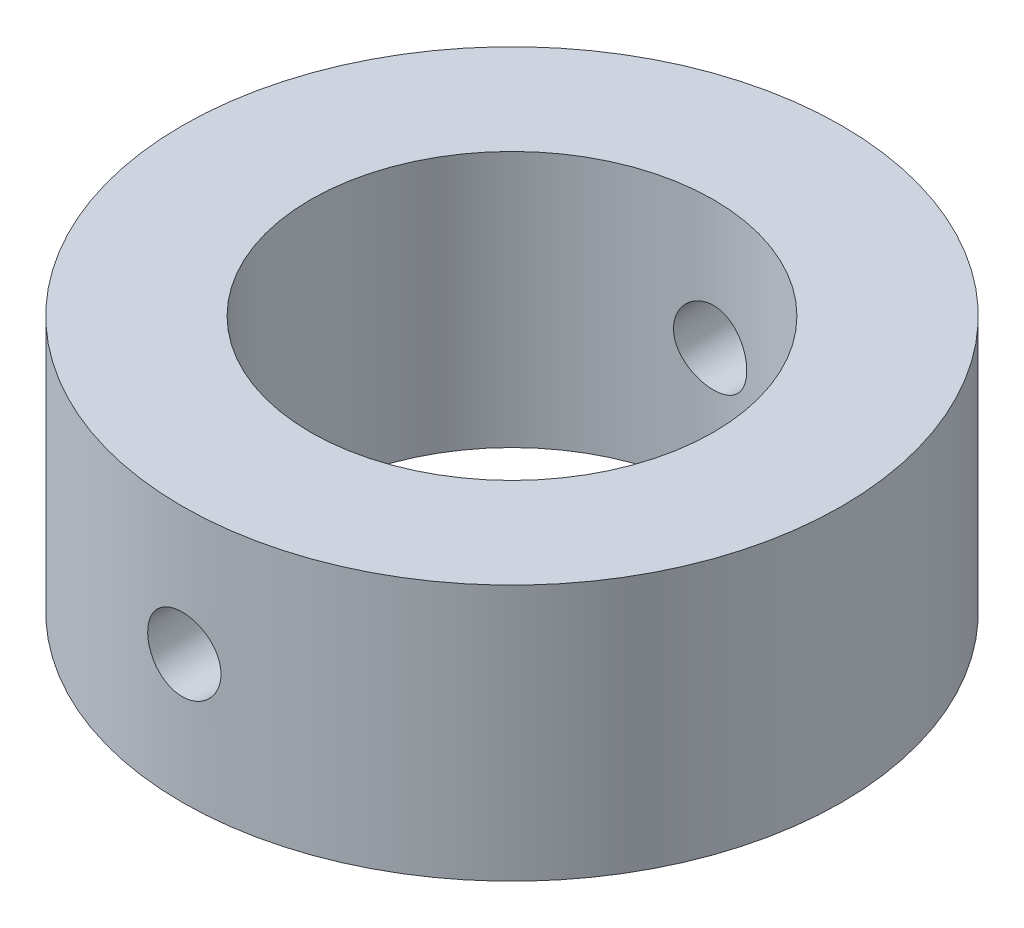
ISO-10303-21;
HEADER;
FILE_DESCRIPTION(('STEP AP214'),'2;1');
FILE_NAME('part.step','',(''),(''),'','','');
FILE_SCHEMA(('AUTOMOTIVE_DESIGN { 1 0 10303 214 1 1 1 1 }'));
ENDSEC;
DATA;
#1=APPLICATION_CONTEXT('core data for automotive mechanical design processes');
#2=APPLICATION_PROTOCOL_DEFINITION('international standard','automotive_design',2000,#1);
#3=PRODUCT_CONTEXT('',#1,'mechanical');
#4=PRODUCT('Part','Part','',(#3));
#5=PRODUCT_RELATED_PRODUCT_CATEGORY('part','',(#4));
#6=PRODUCT_DEFINITION_FORMATION('','',#4);
#7=PRODUCT_DEFINITION_CONTEXT('part definition',#1,'design');
#8=PRODUCT_DEFINITION('design','',#6,#7);
#9=PRODUCT_DEFINITION_SHAPE('','',#8);
#10=(LENGTH_UNIT() NAMED_UNIT(*) SI_UNIT(.MILLI.,.METRE.));
#11=(NAMED_UNIT(*) PLANE_ANGLE_UNIT() SI_UNIT($,.RADIAN.));
#12=(NAMED_UNIT(*) SI_UNIT($,.STERADIAN.) SOLID_ANGLE_UNIT());
#13=UNCERTAINTY_MEASURE_WITH_UNIT(LENGTH_MEASURE(1.E-05),#10,'distance_accuracy_value','');
#14=(GEOMETRIC_REPRESENTATION_CONTEXT(3) GLOBAL_UNCERTAINTY_ASSIGNED_CONTEXT((#13)) GLOBAL_UNIT_ASSIGNED_CONTEXT((#10,
#11,#12)) REPRESENTATION_CONTEXT('',''));
#15=CARTESIAN_POINT('',(0.,0.,0.));
#16=DIRECTION('',(0.,0.,1.));
#17=DIRECTION('',(1.,0.,0.));
#18=AXIS2_PLACEMENT_3D('',#15,#16,#17);
#19=CARTESIAN_POINT('',(0.,14.,0.));
#20=DIRECTION('',(0.,1.,0.));
#21=DIRECTION('',(0.,0.,1.));
#22=AXIS2_PLACEMENT_3D('',#19,#20,#21);
#23=PLANE('',#22);
#24=CARTESIAN_POINT('',(0.,14.,0.));
#25=DIRECTION('',(0.,1.,0.));
#26=DIRECTION('',(0.,0.,1.));
#27=AXIS2_PLACEMENT_3D('',#24,#25,#26);
#28=CIRCLE('',#27,18.);
#29=CARTESIAN_POINT('',(0.,14.,18.));
#30=VERTEX_POINT('',#29);
#31=EDGE_CURVE('E10',#30,#30,#28,.T.);
#32=ORIENTED_EDGE('',*,*,#31,.T.);
#33=EDGE_LOOP('',(#32));
#34=FACE_BOUND('',#33,.T.);
#35=CARTESIAN_POINT('',(0.,14.,0.));
#36=DIRECTION('',(0.,1.,0.));
#37=DIRECTION('',(0.,0.,1.));
#38=AXIS2_PLACEMENT_3D('',#35,#36,#37);
#39=CIRCLE('',#38,11.);
#40=CARTESIAN_POINT('',(0.,14.,11.));
#41=VERTEX_POINT('',#40);
#42=EDGE_CURVE('E61',#41,#41,#39,.T.);
#43=ORIENTED_EDGE('',*,*,#42,.F.);
#44=EDGE_LOOP('',(#43));
#45=FACE_BOUND('',#44,.T.);
#46=ADVANCED_FACE('F40',(#34,#45),#23,.T.);
#47=CARTESIAN_POINT('',(0.,0.,0.));
#48=DIRECTION('',(0.,1.,0.));
#49=DIRECTION('',(0.,0.,1.));
#50=AXIS2_PLACEMENT_3D('',#47,#48,#49);
#51=PLANE('',#50);
#52=CARTESIAN_POINT('',(0.,0.,0.));
#53=DIRECTION('',(0.,1.,0.));
#54=DIRECTION('',(0.,0.,1.));
#55=AXIS2_PLACEMENT_3D('',#52,#53,#54);
#56=CIRCLE('',#55,18.);
#57=CARTESIAN_POINT('',(0.,0.,18.));
#58=VERTEX_POINT('',#57);
#59=EDGE_CURVE('E55',#58,#58,#56,.T.);
#60=ORIENTED_EDGE('',*,*,#59,.F.);
#61=EDGE_LOOP('',(#60));
#62=FACE_BOUND('',#61,.T.);
#63=CARTESIAN_POINT('',(0.,0.,0.));
#64=DIRECTION('',(0.,1.,0.));
#65=DIRECTION('',(0.,0.,1.));
#66=AXIS2_PLACEMENT_3D('',#63,#64,#65);
#67=CIRCLE('',#66,11.);
#68=CARTESIAN_POINT('',(0.,0.,11.));
#69=VERTEX_POINT('',#68);
#70=EDGE_CURVE('E64',#69,#69,#67,.T.);
#71=ORIENTED_EDGE('',*,*,#70,.T.);
#72=EDGE_LOOP('',(#71));
#73=FACE_BOUND('',#72,.T.);
#74=ADVANCED_FACE('F105',(#62,#73),#51,.F.);
#75=CARTESIAN_POINT('',(0.,14.,0.));
#76=DIRECTION('',(0.,-1.,0.));
#77=DIRECTION('',(0.,0.,-1.));
#78=AXIS2_PLACEMENT_3D('',#75,#76,#77);
#79=CYLINDRICAL_SURFACE('',#78,18.);
#80=CARTESIAN_POINT('',(0.,9.,-18.));
#81=CARTESIAN_POINT('',(-0.111970632349519,8.99999518717274,-17.9999985855436));
#82=CARTESIAN_POINT('',(-0.22401360296951,8.99056525489512,-17.9989441411048));
#83=CARTESIAN_POINT('',(-0.444988473846702,8.95309247157582,-17.9948391595619));
#84=CARTESIAN_POINT('',(-0.553916889117786,8.92502956094916,-17.9917864712715));
#85=CARTESIAN_POINT('',(-0.765431079070291,8.85112204481784,-17.9840293073923));
#86=CARTESIAN_POINT('',(-0.868020820737628,8.8052886941403,-17.9793258774716));
#87=CARTESIAN_POINT('',(-1.06403053009986,8.69716438580146,-17.9687919810869));
#88=CARTESIAN_POINT('',(-1.1574522117349,8.63487651233084,-17.9629617258869));
#89=CARTESIAN_POINT('',(-1.33290575747026,8.49531794987183,-17.9507977181856));
#90=CARTESIAN_POINT('',(-1.4148915795421,8.41798953514322,-17.9444620831364));
#91=CARTESIAN_POINT('',(-1.56475003710051,8.2506685239635,-17.9320167832537));
#92=CARTESIAN_POINT('',(-1.63262199299226,8.16067531804146,-17.9259071293129));
#93=CARTESIAN_POINT('',(-1.7524930181623,7.97028607176977,-17.9145866794937));
#94=CARTESIAN_POINT('',(-1.80444975542339,7.86986322295015,-17.9093782965755));
#95=CARTESIAN_POINT('',(-1.89074517800796,7.66165053931293,-17.9004741803531));
#96=CARTESIAN_POINT('',(-1.92508439501976,7.553860926932,-17.8967784014));
#97=CARTESIAN_POINT('',(-1.97503194492644,7.3344480021357,-17.8913354423153));
#98=CARTESIAN_POINT('',(-1.99071729842217,7.22284242492906,-17.8895802517469));
#99=CARTESIAN_POINT('',(-2.00315006003506,6.99857013816991,-17.8881925066123));
#100=CARTESIAN_POINT('',(-1.99989807564483,6.88590346277222,-17.8885598839559));
#101=CARTESIAN_POINT('',(-1.97461184427901,6.66324052502841,-17.891368441014));
#102=CARTESIAN_POINT('',(-1.95266200172973,6.5532345433254,-17.8938003012309));
#103=CARTESIAN_POINT('',(-1.89073461157689,6.33847737461124,-17.9004492717341));
#104=CARTESIAN_POINT('',(-1.85075676930152,6.23372627352343,-17.904666411201));
#105=CARTESIAN_POINT('',(-1.75381606079451,6.03218757683689,-17.9144214425039));
#106=CARTESIAN_POINT('',(-1.6968160688148,5.93541798398418,-17.9199622158801));
#107=CARTESIAN_POINT('',(-1.56747570663675,5.75278634926913,-17.9317378723191));
#108=CARTESIAN_POINT('',(-1.49513478176794,5.66692470197665,-17.9379727804753));
#109=CARTESIAN_POINT('',(-1.33669614893956,5.50805601569139,-17.9504756897929));
#110=CARTESIAN_POINT('',(-1.25052560566827,5.43512159477525,-17.9567436860931));
#111=CARTESIAN_POINT('',(-1.06712581996098,5.30474161832766,-17.9685745710182));
#112=CARTESIAN_POINT('',(-0.969896560277035,5.24729608695424,-17.9741374585434));
#113=CARTESIAN_POINT('',(-0.767086635535504,5.14952623523524,-17.9839338102592));
#114=CARTESIAN_POINT('',(-0.661504004801704,5.10920595902494,-17.9881669603705));
#115=CARTESIAN_POINT('',(-0.445009755639361,5.04688622495833,-17.9948238450129));
#116=CARTESIAN_POINT('',(-0.334098334257908,5.02488609021367,-17.997247646395));
#117=CARTESIAN_POINT('',(-0.110723331894269,4.99992409828247,-18.0000041106556));
#118=CARTESIAN_POINT('',(0.00172892889089268,4.99686210620379,-18.0003477720089));
#119=CARTESIAN_POINT('',(0.225544988687161,5.00959979251307,-17.998934812043));
#120=CARTESIAN_POINT('',(0.33690880589132,5.02539915509292,-17.9971782258895));
#121=CARTESIAN_POINT('',(0.555095059423332,5.07532794045585,-17.9917690933051));
#122=CARTESIAN_POINT('',(0.661928438561837,5.10941011811748,-17.9881214344582));
#123=CARTESIAN_POINT('',(0.868362270126897,5.19488827772812,-17.9793390034164));
#124=CARTESIAN_POINT('',(0.967962524792293,5.24628473285104,-17.9742041905801));
#125=CARTESIAN_POINT('',(1.15755326511746,5.36517829107097,-17.9629935700227));
#126=CARTESIAN_POINT('',(1.24750253139102,5.43274076093982,-17.9569139780361));
#127=CARTESIAN_POINT('',(1.41481983480219,5.58195529833437,-17.9445071585437));
#128=CARTESIAN_POINT('',(1.49218748015557,5.66360780445235,-17.938179923334));
#129=CARTESIAN_POINT('',(1.63249622432816,5.83912328906606,-17.925957484036));
#130=CARTESIAN_POINT('',(1.69537132537921,5.93303919047828,-17.920064336427));
#131=CARTESIAN_POINT('',(1.80445556005008,6.13015628349244,-17.9094097287312));
#132=CARTESIAN_POINT('',(1.85066496700075,6.23335732277591,-17.9046482500845));
#133=CARTESIAN_POINT('',(1.92499712101143,6.44589445871662,-17.8968094822665));
#134=CARTESIAN_POINT('',(1.95315827481128,6.55521698574758,-17.8937286188355));
#135=CARTESIAN_POINT('',(1.99071877766797,6.77707514774163,-17.8895891957456));
#136=CARTESIAN_POINT('',(2.00011880320655,6.88961066670345,-17.8885305631698));
#137=CARTESIAN_POINT('',(1.99987957341679,7.11404415506505,-17.8885572584665));
#138=CARTESIAN_POINT('',(1.99034399043058,7.22594225068095,-17.8896309120887));
#139=CARTESIAN_POINT('',(1.9527225008048,7.4465357383256,-17.8937762295707));
#140=CARTESIAN_POINT('',(1.92463658036714,7.55523112797206,-17.8968478949167));
#141=CARTESIAN_POINT('',(1.85074191262564,7.76632751050922,-17.9046397451111));
#142=CARTESIAN_POINT('',(1.80493703938195,7.86872987363542,-17.9093595695852));
#143=CARTESIAN_POINT('',(1.69691508787252,8.0644104934481,-17.9199166120206));
#144=CARTESIAN_POINT('',(1.63469797623759,8.15768873158296,-17.9257538322538));
#145=CARTESIAN_POINT('',(1.49522995253707,8.33300424612643,-17.9379262794022));
#146=CARTESIAN_POINT('',(1.41790170900318,8.41497983547593,-17.944263963574));
#147=CARTESIAN_POINT('',(1.25056419248413,8.5648338722108,-17.9567010614173));
#148=CARTESIAN_POINT('',(1.16055190760651,8.63270896185917,-17.962800418056));
#149=CARTESIAN_POINT('',(0.970094486774867,8.75260433035013,-17.9740935209669));
#150=CARTESIAN_POINT('',(0.869618446416091,8.80457574973094,-17.9792844558708));
#151=CARTESIAN_POINT('',(0.661368495161231,8.89083749244483,-17.9881463543356));
#152=CARTESIAN_POINT('',(0.553602839944441,8.92514745073419,-17.9918190049356));
#153=CARTESIAN_POINT('',(0.371040239312598,8.96669916146577,-17.9963232552591));
#154=CARTESIAN_POINT('',(0.297404134861363,8.97916954843922,-17.9976954860037));
#155=CARTESIAN_POINT('',(0.149189389902708,8.99582154886399,-17.9995343271896));
#156=CARTESIAN_POINT('',(0.074610754477507,9.00000320698978,-18.000000942512));
#157=CARTESIAN_POINT('',(0.,9.,-18.));
#158=B_SPLINE_CURVE_WITH_KNOTS('',3,(#80,#81,#82,#83,#84,#85,#86,#87,#88,#89,#90,#91,#92,#93,
#94,#95,#96,#97,#98,#99,#100,#101,#102,#103,#104,#105,#106,#107,#108,#109,#110,#111,#112,#113,
#114,#115,#116,#117,#118,#119,#120,#121,#122,#123,#124,#125,#126,#127,#128,#129,#130,#131,#132,
#133,#134,#135,#136,#137,#138,#139,#140,#141,#142,#143,#144,#145,#146,#147,#148,#149,#150,#151,
#152,#153,#154,#155,#156,#157),.UNSPECIFIED.,.T.,.F.,(4,2,2,2,2,2,2,2,2,2,2,2,2,2,2,2,2,2,2,2,2,
2,2,2,2,2,2,2,2,2,2,2,2,2,2,2,2,2,4),(0.,0.335639414270807,0.671640752838988,1.00742963320074,
1.34315561881719,1.68019649784365,2.01725360192296,2.35519959306228,2.69313538455338,
3.02967096220247,3.36619574415512,3.70120941343134,4.03622855878184,4.37198379333011,
4.70775116959619,5.0453487253329,5.3829468076176,5.72062456954608,6.05828985448105,
6.39416820670407,6.73004093517319,7.06504987759406,7.40006797606269,7.73646430887643,
8.07287111486782,8.41078088557856,8.74868511404414,9.08586787252136,9.42303847276942,
9.75836815539861,10.0936980874527,10.4289547445926,10.7642120833782,11.1012322946639,
11.4383326684529,11.7764585228658,12.1142076528796,12.3378595549845,12.5615102516508),.UNSPECIFIED.);
#159=CARTESIAN_POINT('',(0.,9.,-18.));
#160=VERTEX_POINT('',#159);
#161=EDGE_CURVE('E91',#160,#160,#158,.T.);
#162=ORIENTED_EDGE('',*,*,#161,.T.);
#163=EDGE_LOOP('',(#162));
#164=FACE_BOUND('',#163,.T.);
#165=CARTESIAN_POINT('',(2.,7.,17.8885438199983));
#166=CARTESIAN_POINT('',(1.99999518503575,6.88803177304581,17.8885452673513));
#167=CARTESIAN_POINT('',(1.99056564422495,6.77599120047101,17.8896064083062));
#168=CARTESIAN_POINT('',(1.9530945571327,6.55502131188617,17.8937353069379));
#169=CARTESIAN_POINT('',(1.92503294287933,6.44609548275034,17.8968052281518));
#170=CARTESIAN_POINT('',(1.85112921882987,6.23458676194979,17.9045997629771));
#171=CARTESIAN_POINT('',(1.80529842543048,6.13199988140329,17.9093233232741));
#172=CARTESIAN_POINT('',(1.6971801398522,5.9359949687069,17.9198916263535));
#173=CARTESIAN_POINT('',(1.63489572561389,5.84257522615985,17.9257361593821));
#174=CARTESIAN_POINT('',(1.49534066211955,5.66711950181866,17.9379170304468));
#175=CARTESIAN_POINT('',(1.41801151386004,5.58513017364171,17.9442552283822));
#176=CARTESIAN_POINT('',(1.25068756201248,5.43526494609341,17.956692464558));
#177=CARTESIAN_POINT('',(1.16069215853742,5.3673897155578,17.9627914914535));
#178=CARTESIAN_POINT('',(0.970300975910866,5.24751525739638,17.9740818874251));
#179=CARTESIAN_POINT('',(0.869878766261949,5.19555776276641,17.9792708555609));
#180=CARTESIAN_POINT('',(0.661667471517998,5.10926076380114,17.9881361419533));
#181=CARTESIAN_POINT('',(0.553878605135573,5.0749207366687,17.9918125050957));
#182=CARTESIAN_POINT('',(0.334468008621896,5.02497150677824,17.9972252779851));
#183=CARTESIAN_POINT('',(0.222864029559306,5.00928520821169,17.9989696704928));
#184=CARTESIAN_POINT('',(-0.00140512478551065,4.99685000269704,18.0003491557537));
#185=CARTESIAN_POINT('',(-0.114070266492343,5.00010049858126,17.999984315021));
#186=CARTESIAN_POINT('',(-0.336739745879571,5.02538436478206,17.9971929428148));
#187=CARTESIAN_POINT('',(-0.446753627473802,5.04733482935178,17.9947755115965));
#188=CARTESIAN_POINT('',(-0.661526274498665,5.10926619852694,17.9881609397357));
#189=CARTESIAN_POINT('',(-0.766284958137244,5.14924738366635,17.983963771403));
#190=CARTESIAN_POINT('',(-0.967832879518121,5.24619503121668,17.9742457977887));
#191=CARTESIAN_POINT('',(-1.06460449111718,5.30319784231176,17.9687221649126));
#192=CARTESIAN_POINT('',(-1.2472389694308,5.43254423068682,17.9569703102514));
#193=CARTESIAN_POINT('',(-1.33310144059904,5.50488836396256,17.9507420629336));
#194=CARTESIAN_POINT('',(-1.49196653465317,5.66332928308718,17.9382394115377));
#195=CARTESIAN_POINT('',(-1.56489718633274,5.74949824654401,17.9319649398659));
#196=CARTESIAN_POINT('',(-1.69527030904771,5.93289352468536,17.9201104242365));
#197=CARTESIAN_POINT('',(-1.75271274805118,6.03011986223758,17.9145303817151));
#198=CARTESIAN_POINT('',(-1.85048037105374,6.23292897346975,17.9046962899179));
#199=CARTESIAN_POINT('',(-1.89080055980943,6.3385141751196,17.9004426276963));
#200=CARTESIAN_POINT('',(-1.95311933213687,6.55501401575792,17.8937507545429));
#201=CARTESIAN_POINT('',(-1.97511860833,6.66592845310717,17.891312474981));
#202=CARTESIAN_POINT('',(-2.00007735935568,6.88930489303505,17.8885396347188));
#203=CARTESIAN_POINT('',(-2.00313777083876,7.00175548459326,17.8881939216838));
#204=CARTESIAN_POINT('',(-1.99039751910215,7.22556782703135,17.8896159038576));
#205=CARTESIAN_POINT('',(-1.97459717180621,7.33692959611784,17.8913835636668));
#206=CARTESIAN_POINT('',(-1.92466859187558,7.55510548533968,17.8968229651343));
#207=CARTESIAN_POINT('',(-1.89058856475884,7.66193077267579,17.9004896978583));
#208=CARTESIAN_POINT('',(-1.80511741398991,7.86834937118393,17.9093100409564));
#209=CARTESIAN_POINT('',(-1.75372580444061,7.96794247926959,17.9144636930643));
#210=CARTESIAN_POINT('',(-1.63483941033055,8.15752829319359,17.9257040762847));
#211=CARTESIAN_POINT('',(-1.56727802875607,8.24747900693807,17.9317946280501));
#212=CARTESIAN_POINT('',(-1.41806481392953,8.41479973723392,17.9442102793975));
#213=CARTESIAN_POINT('',(-1.33641254922635,8.49216936842207,17.9505353861567));
#214=CARTESIAN_POINT('',(-1.1608962097233,8.63248248532022,17.9627413925405));
#215=CARTESIAN_POINT('',(-1.066979166732,8.69535992327815,17.968620179616));
#216=CARTESIAN_POINT('',(-0.86985915963698,8.80444825682681,17.9792400807963));
#217=CARTESIAN_POINT('',(-0.766656348352905,8.85065942663837,17.9839812136192));
#218=CARTESIAN_POINT('',(-0.554120264945936,8.92499272889714,17.9917821449637));
#219=CARTESIAN_POINT('',(-0.444800831566826,8.95315403200578,17.9948455821934));
#220=CARTESIAN_POINT('',(-0.22294920075792,8.99071588146752,17.9989609669259));
#221=CARTESIAN_POINT('',(-0.110417116473335,9.00011708770109,18.0000129851797));
#222=CARTESIAN_POINT('',(0.114018334496891,8.99988133626741,17.9999868395735));
#223=CARTESIAN_POINT('',(0.225921823844596,8.99034661842582,17.9989201153349));
#224=CARTESIAN_POINT('',(0.446526316926464,8.95272496321899,17.9947989686735));
#225=CARTESIAN_POINT('',(0.555227319914944,8.92463802153398,17.9917445457879));
#226=CARTESIAN_POINT('',(0.76633507661575,8.85073915596262,17.9839899544047));
#227=CARTESIAN_POINT('',(0.868743176076879,8.8049310371763,17.9792901392271));
#228=CARTESIAN_POINT('',(1.06443391664963,8.69690081603448,17.9687671981842));
#229=CARTESIAN_POINT('',(1.15771654277212,8.63467868671863,17.9629440704738));
#230=CARTESIAN_POINT('',(1.33303189850074,8.49520510358297,17.9507882968297));
#231=CARTESIAN_POINT('',(1.41500385164122,8.41787746860297,17.9444531678765));
#232=CARTESIAN_POINT('',(1.56485083590747,8.2505426709214,17.9320080016661));
#233=CARTESIAN_POINT('',(1.63272249971267,8.16053248806638,17.9258980184622));
#234=CARTESIAN_POINT('',(1.75261413385152,7.97007682032628,17.9145748576723));
#235=CARTESIAN_POINT('',(1.80458464165387,7.86960005134217,17.9093644999484));
#236=CARTESIAN_POINT('',(1.89084447897051,7.66134856315658,17.9004638112766));
#237=CARTESIAN_POINT('',(1.92515345522498,7.55358210473051,17.8967717922482));
#238=CARTESIAN_POINT('',(1.96670243154842,7.37102212505551,17.8922425310128));
#239=CARTESIAN_POINT('',(1.97917158766845,7.29738963768033,17.8908622174332));
#240=CARTESIAN_POINT('',(1.99582195322212,7.1491821369307,17.8890123822324));
#241=CARTESIAN_POINT('',(2.00000320832675,7.07460712875234,17.8885428555921));
#242=CARTESIAN_POINT('',(2.,7.,17.8885438199983));
#243=B_SPLINE_CURVE_WITH_KNOTS('',3,(#165,#166,#167,#168,#169,#170,#171,#172,#173,#174,#175,
#176,#177,#178,#179,#180,#181,#182,#183,#184,#185,#186,#187,#188,#189,#190,#191,#192,#193,#194,
#195,#196,#197,#198,#199,#200,#201,#202,#203,#204,#205,#206,#207,#208,#209,#210,#211,#212,#213,
#214,#215,#216,#217,#218,#219,#220,#221,#222,#223,#224,#225,#226,#227,#228,#229,#230,#231,#232,
#233,#234,#235,#236,#237,#238,#239,#240,#241,#242),.UNSPECIFIED.,.T.,.F.,(4,2,2,2,2,2,2,2,2,2,2,
2,2,2,2,2,2,2,2,2,2,2,2,2,2,2,2,2,2,2,2,2,2,2,2,2,2,2,4),(0.,0.335632188624974,
0.671626462934656,1.00740710805003,1.34312498388733,1.68017531935543,2.01724162325253,
2.35518422792107,2.69311680358594,3.02964779613957,3.36616817631888,3.70120432175367,
4.03624568008393,4.37200767925155,4.70778184908852,5.04536979065502,5.3829584303983,
5.7206454906652,6.0583197841067,6.39419284630556,6.73006028260191,7.06504632328859,
7.40004176706191,7.73644141772486,8.07285137049335,8.41076545330537,8.74867397594563,
9.08584668590625,9.42300753571449,9.7583529180042,10.0936983783768,10.4289718731341,
10.7642459185884,11.1012566562892,11.4383477839705,11.7764770582129,12.1142293791938,
12.3378704296957,12.5615102478061),.UNSPECIFIED.);
#244=CARTESIAN_POINT('',(2.,7.,17.8885438199983));
#245=VERTEX_POINT('',#244);
#246=EDGE_CURVE('E85',#245,#245,#243,.T.);
#247=ORIENTED_EDGE('',*,*,#246,.T.);
#248=EDGE_LOOP('',(#247));
#249=FACE_BOUND('',#248,.T.);
#250=ORIENTED_EDGE('',*,*,#31,.F.);
#251=EDGE_LOOP('',(#250));
#252=FACE_BOUND('',#251,.T.);
#253=ORIENTED_EDGE('',*,*,#59,.T.);
#254=EDGE_LOOP('',(#253));
#255=FACE_BOUND('',#254,.T.);
#256=ADVANCED_FACE('F42',(#164,#249,#252,#255),#79,.T.);
#257=CARTESIAN_POINT('',(0.,14.,0.));
#258=DIRECTION('',(0.,-1.,0.));
#259=DIRECTION('',(0.,0.,-1.));
#260=AXIS2_PLACEMENT_3D('',#257,#258,#259);
#261=CYLINDRICAL_SURFACE('',#260,11.);
#262=CARTESIAN_POINT('',(0.,9.,-11.));
#263=CARTESIAN_POINT('',(-0.111357271644373,8.99999568133932,-10.9999980072786));
#264=CARTESIAN_POINT('',(-0.222771449918202,8.99066824251735,-10.9982915273343));
#265=CARTESIAN_POINT('',(-0.442464406848309,8.95362653397508,-10.99164847502));
#266=CARTESIAN_POINT('',(-0.550740387266074,8.92589635141863,-10.9867091072254));
#267=CARTESIAN_POINT('',(-0.760947572513748,8.85292287032901,-10.9741532323507));
#268=CARTESIAN_POINT('',(-0.862884263930176,8.80769496781024,-10.9665390793192));
#269=CARTESIAN_POINT('',(-1.0577120033845,8.70105266880821,-10.949466714983));
#270=CARTESIAN_POINT('',(-1.15060386767904,8.63963973481181,-10.9400086703132));
#271=CARTESIAN_POINT('',(-1.32576444051238,8.50163409035729,-10.9201743349983));
#272=CARTESIAN_POINT('',(-1.40791622603346,8.42489415801924,-10.9097897259708));
#273=CARTESIAN_POINT('',(-1.55825357341079,8.25872964591017,-10.8893349521181));
#274=CARTESIAN_POINT('',(-1.62643816794977,8.16930418831085,-10.8792648091126));
#275=CARTESIAN_POINT('',(-1.74738695016477,7.97948727054023,-10.8604984020977));
#276=CARTESIAN_POINT('',(-1.80003313265556,7.87901946476963,-10.851812871101));
#277=CARTESIAN_POINT('',(-1.88765546949978,7.67048134967603,-10.836915832769));
#278=CARTESIAN_POINT('',(-1.92263305283275,7.56241165597496,-10.8307041253674));
#279=CARTESIAN_POINT('',(-1.97355197711315,7.3429853506434,-10.8215415351671));
#280=CARTESIAN_POINT('',(-1.98969666425445,7.23167740829037,-10.8185558462234));
#281=CARTESIAN_POINT('',(-2.00312248736688,7.00789559268543,-10.8160783143231));
#282=CARTESIAN_POINT('',(-2.00040521296643,6.89542181848397,-10.8165861769405));
#283=CARTESIAN_POINT('',(-1.97634934427,6.67396808586698,-10.8210066504918));
#284=CARTESIAN_POINT('',(-1.95524117699072,6.56496213210428,-10.8248771281426));
#285=CARTESIAN_POINT('',(-1.89536523340026,6.35206498163283,-10.8355206127391));
#286=CARTESIAN_POINT('',(-1.85659674743188,6.24817399064821,-10.8422937363232));
#287=CARTESIAN_POINT('',(-1.76227297789295,6.04777720922126,-10.8580238155272));
#288=CARTESIAN_POINT('',(-1.7066239037154,5.95131655733387,-10.8669929171435));
#289=CARTESIAN_POINT('',(-1.58018503374043,5.76901526305471,-10.8860962201172));
#290=CARTESIAN_POINT('',(-1.50939379023584,5.68317563735376,-10.8962305328347));
#291=CARTESIAN_POINT('',(-1.35343399418352,5.52322100355563,-10.9167064080854));
#292=CARTESIAN_POINT('',(-1.2680681726569,5.44929831156309,-10.9270488181647));
#293=CARTESIAN_POINT('',(-1.08604454069331,5.31679486651917,-10.9466375043709));
#294=CARTESIAN_POINT('',(-0.989386629498157,5.25821425037874,-10.9558837707156));
#295=CARTESIAN_POINT('',(-0.787327598497296,5.15803261021497,-10.9722553782534));
#296=CARTESIAN_POINT('',(-0.681916780395492,5.11645073130402,-10.9793783255922));
#297=CARTESIAN_POINT('',(-0.465448414462666,5.0516368075063,-10.9906820547088));
#298=CARTESIAN_POINT('',(-0.354391431316065,5.02840293142609,-10.994863130091));
#299=CARTESIAN_POINT('',(-0.131438649578499,5.00121023808088,-10.9997719337866));
#300=CARTESIAN_POINT('',(-0.0195760121089341,4.99698777654592,-11.0005468934114));
#301=CARTESIAN_POINT('',(0.203257238970967,5.00723179818149,-10.998686302475));
#302=CARTESIAN_POINT('',(0.314227893453082,5.02169742007174,-10.9960509090871));
#303=CARTESIAN_POINT('',(0.531297097592757,5.06868774956188,-10.9876950863245));
#304=CARTESIAN_POINT('',(0.637425297458317,5.10107986918283,-10.9819973157216));
#305=CARTESIAN_POINT('',(0.84274471375661,5.18286082852194,-10.9681529512222));
#306=CARTESIAN_POINT('',(0.941935480960949,5.2322507676977,-10.9600061989244));
#307=CARTESIAN_POINT('',(1.13169524707493,5.34721463780293,-10.9420497958484));
#308=CARTESIAN_POINT('',(1.22216445208488,5.41295068715592,-10.932223816146));
#309=CARTESIAN_POINT('',(1.39088213822347,5.5585203766711,-10.9120428807109));
#310=CARTESIAN_POINT('',(1.46912954974332,5.63835524941194,-10.901687878785));
#311=CARTESIAN_POINT('',(1.6121773788768,5.8110468814485,-10.8814603955764));
#312=CARTESIAN_POINT('',(1.67679836741418,5.90405330652586,-10.8715955212189));
#313=CARTESIAN_POINT('',(1.78949986552014,6.09975618140649,-10.8536151008102));
#314=CARTESIAN_POINT('',(1.83758096630795,6.20245228468438,-10.8454994922354));
#315=CARTESIAN_POINT('',(1.91557945241746,6.41415074969175,-10.8319954461548));
#316=CARTESIAN_POINT('',(1.9455810786184,6.52312123073805,-10.8265943801675));
#317=CARTESIAN_POINT('',(1.98683040178554,6.74466298863107,-10.8191012654539));
#318=CARTESIAN_POINT('',(1.99808007453629,6.85723388484892,-10.8170088681136));
#319=CARTESIAN_POINT('',(2.00144313663184,7.08098537546364,-10.8163869388262));
#320=CARTESIAN_POINT('',(1.99383937001232,7.19216167143854,-10.8178047454411));
#321=CARTESIAN_POINT('',(1.96032846912815,7.41162363801741,-10.8239270874703));
#322=CARTESIAN_POINT('',(1.93442142905718,7.51990932349428,-10.8286316059701));
#323=CARTESIAN_POINT('',(1.86515567158476,7.73037619739537,-10.8407757208091));
#324=CARTESIAN_POINT('',(1.82182581019232,7.83256716022343,-10.8482107929975));
#325=CARTESIAN_POINT('',(1.71897473664823,8.02827444716474,-10.8649817751485));
#326=CARTESIAN_POINT('',(1.65945247569007,8.12179020884559,-10.8743178082294));
#327=CARTESIAN_POINT('',(1.52491543662799,8.29891287459562,-10.8940032465147));
#328=CARTESIAN_POINT('',(1.44969415553099,8.38236156987076,-10.9043650783111));
#329=CARTESIAN_POINT('',(1.28632651423364,8.53554708101219,-10.9248399206865));
#330=CARTESIAN_POINT('',(1.19817718680093,8.60528074039225,-10.9349528735191));
#331=CARTESIAN_POINT('',(1.0105711896463,8.72960029712349,-10.9538897429719));
#332=CARTESIAN_POINT('',(0.911025849790496,8.78405418518013,-10.9627021317343));
#333=CARTESIAN_POINT('',(0.704073905086344,8.87537921607406,-10.9779326099335));
#334=CARTESIAN_POINT('',(0.596674925486669,8.91226715927832,-10.9843529858473));
#335=CARTESIAN_POINT('',(0.407441749458405,8.95977543030219,-10.9927407037649));
#336=CARTESIAN_POINT('',(0.32672542727649,8.97483433296035,-10.9954478027358));
#337=CARTESIAN_POINT('',(0.164016342132203,8.9949480937949,-10.9990781643304));
#338=CARTESIAN_POINT('',(0.0820236084408331,9.00000318104177,-11.0000014678));
#339=CARTESIAN_POINT('',(0.,9.,-11.));
#340=B_SPLINE_CURVE_WITH_KNOTS('',3,(#262,#263,#264,#265,#266,#267,#268,#269,#270,#271,#272,
#273,#274,#275,#276,#277,#278,#279,#280,#281,#282,#283,#284,#285,#286,#287,#288,#289,#290,#291,
#292,#293,#294,#295,#296,#297,#298,#299,#300,#301,#302,#303,#304,#305,#306,#307,#308,#309,#310,
#311,#312,#313,#314,#315,#316,#317,#318,#319,#320,#321,#322,#323,#324,#325,#326,#327,#328,#329,
#330,#331,#332,#333,#334,#335,#336,#337,#338,#339),.UNSPECIFIED.,.T.,.F.,(4,2,2,2,2,2,2,2,2,2,2,
2,2,2,2,2,2,2,2,2,2,2,2,2,2,2,2,2,2,2,2,2,2,2,2,2,2,2,4),(0.,0.333771891552332,0.66783277207259,
1.00160038286674,1.3353378446015,1.67245014596885,2.00958578663078,2.3492195220365,
2.6888257845573,3.02473021172645,3.36060633024202,3.69233367290895,4.02407434678871,
4.35769306461625,4.69134369321255,5.02993210441872,5.36852353704646,5.70749527023812,
6.04643316861453,6.38065600997364,6.71486344850797,7.0466314328543,7.37842088074221,
7.71364226795666,8.04889297616123,8.38831506130458,8.72772501252474,9.06554101076157,
9.40332141303601,9.73606509730371,10.0688070691931,10.4010002025896,10.733214857769,
11.0701111453004,11.4070848782946,11.7468860454293,12.0863615649817,12.3322171022956,
12.5780670098676),.UNSPECIFIED.);
#341=CARTESIAN_POINT('',(0.,9.,-11.));
#342=VERTEX_POINT('',#341);
#343=EDGE_CURVE('E45',#342,#342,#340,.T.);
#344=ORIENTED_EDGE('',*,*,#343,.F.);
#345=EDGE_LOOP('',(#344));
#346=FACE_BOUND('',#345,.T.);
#347=CARTESIAN_POINT('',(2.,7.,10.816653826392));
#348=CARTESIAN_POINT('',(1.99999566748834,6.88865987742704,10.8166559469823));
#349=CARTESIAN_POINT('',(1.9906710042305,6.777262808712,10.818391586416));
#350=CARTESIAN_POINT('',(1.953641319662,6.55760538412703,10.825138630904));
#351=CARTESIAN_POINT('',(1.92592032102069,6.44934784033072,10.8301528833982));
#352=CARTESIAN_POINT('',(1.85297369289719,6.23917968698149,10.8428709030557));
#353=CARTESIAN_POINT('',(1.80776389192774,6.13726343469195,10.8505722376174));
#354=CARTESIAN_POINT('',(1.70116425408315,5.94247010837104,10.8677937983012));
#355=CARTESIAN_POINT('',(1.6397758372698,5.84959224198362,10.8773138647657));
#356=CARTESIAN_POINT('',(1.50179524823966,5.67441655255824,10.8972247379328));
#357=CARTESIAN_POINT('',(1.4250503534781,5.59223992576605,10.9076236306456));
#358=CARTESIAN_POINT('',(1.25886539634161,5.44185443716557,10.9280489317643));
#359=CARTESIAN_POINT('',(1.1694245247635,5.37364646635462,10.9380753163763));
#360=CARTESIAN_POINT('',(0.979593418999865,5.25267268154977,10.9567122399244));
#361=CARTESIAN_POINT('',(0.879129490479885,5.2000207300042,10.965312146403));
#362=CARTESIAN_POINT('',(0.670599774437609,5.11238666697386,10.9800367733651));
#363=CARTESIAN_POINT('',(0.562534575326679,5.07740318949063,10.98616168519));
#364=CARTESIAN_POINT('',(0.343124837820858,5.02647276674455,10.9951891058833));
#365=CARTESIAN_POINT('',(0.231829128518768,5.01032168567928,10.9981261454525));
#366=CARTESIAN_POINT('',(0.0080714729659247,4.9968788325376,11.0005658088946));
#367=CARTESIAN_POINT('',(-0.104390378935038,4.99958554642846,11.0000687084839));
#368=CARTESIAN_POINT('',(-0.32588919614074,5.02362414207792,10.9957231855211));
#369=CARTESIAN_POINT('',(-0.43495090005335,5.04473625351444,10.9919143087691));
#370=CARTESIAN_POINT('',(-0.647957490603366,5.1046391974615,10.9814174690798));
#371=CARTESIAN_POINT('',(-0.751902198979603,5.14343064538623,10.974729405919));
#372=CARTESIAN_POINT('',(-0.952366225453847,5.23780305977916,10.9591592037236));
#373=CARTESIAN_POINT('',(-1.04884289251747,5.29347264403384,10.9502655302338));
#374=CARTESIAN_POINT('',(-1.23116763357293,5.41995588992469,10.9312689682172));
#375=CARTESIAN_POINT('',(-1.31701468769822,5.49077100293549,10.9211659638428));
#376=CARTESIAN_POINT('',(-1.47694445054394,5.64674845457928,10.9006990809284));
#377=CARTESIAN_POINT('',(-1.55083959404949,5.73210301791899,10.8903335415211));
#378=CARTESIAN_POINT('',(-1.68329271964166,5.91409406392092,10.8706496206858));
#379=CARTESIAN_POINT('',(-1.74185050296967,6.01073069276526,10.861331252829));
#380=CARTESIAN_POINT('',(-1.84201538249093,6.21278251048683,10.8447947340983));
#381=CARTESIAN_POINT('',(-1.88359655385222,6.31821083163979,10.8375798001274));
#382=CARTESIAN_POINT('',(-1.94840376886998,6.53471744988837,10.8261173347694));
#383=CARTESIAN_POINT('',(-1.97163175896676,6.64579514651115,10.8218694887144));
#384=CARTESIAN_POINT('',(-1.99880217851546,6.86875980120541,10.8168840409274));
#385=CARTESIAN_POINT('',(-2.00301348489165,6.98061293266964,10.8160975038278));
#386=CARTESIAN_POINT('',(-1.9927505477885,7.20342455056108,10.8179929515389));
#387=CARTESIAN_POINT('',(-1.97827717035789,7.31438307821396,10.8206747755886));
#388=CARTESIAN_POINT('',(-1.93128609638897,7.53138034405228,10.8291592937867));
#389=CARTESIAN_POINT('',(-1.89890818855376,7.63745038400803,10.8349378000789));
#390=CARTESIAN_POINT('',(-1.81717497571878,7.84265971882844,10.8489439080076));
#391=CARTESIAN_POINT('',(-1.76781848506108,7.94179852908568,10.8571716806773));
#392=CARTESIAN_POINT('',(-1.65290586187994,8.13151919601525,10.8752613415266));
#393=CARTESIAN_POINT('',(-1.58717917941566,8.22199611808438,10.8851400484298));
#394=CARTESIAN_POINT('',(-1.44162304950736,8.39073369159776,10.9053706629202));
#395=CARTESIAN_POINT('',(-1.36179241301324,8.46899331199966,10.91572261035));
#396=CARTESIAN_POINT('',(-1.18909630007261,8.61207284614979,10.9358898604531));
#397=CARTESIAN_POINT('',(-1.09608023252376,8.6767123553618,10.9456968282676));
#398=CARTESIAN_POINT('',(-0.900352619793527,8.789446306083,10.9635308137777));
#399=CARTESIAN_POINT('',(-0.797641432067847,8.83754135727717,10.9715578970606));
#400=CARTESIAN_POINT('',(-0.585948218345343,8.91554803863644,10.9848917263157));
#401=CARTESIAN_POINT('',(-0.47700032935395,8.94554990487653,10.9902119510479));
#402=CARTESIAN_POINT('',(-0.255506648963479,8.98680734329715,10.9975899747809));
#403=CARTESIAN_POINT('',(-0.14296121367923,8.99806476513671,10.9996480956777));
#404=CARTESIAN_POINT('',(0.0807996190288183,9.00145252110551,11.0002641421388));
#405=CARTESIAN_POINT('',(0.192010837925449,8.99385588848469,10.9988720323112));
#406=CARTESIAN_POINT('',(0.411544538990868,8.96034705357606,10.9928473390214));
#407=CARTESIAN_POINT('',(0.519867045363828,8.93443500480099,10.9882147827193));
#408=CARTESIAN_POINT('',(0.730415433440432,8.86514309651074,10.9762290690773));
#409=CARTESIAN_POINT('',(0.832650596646199,8.82179065462444,10.96888018348));
#410=CARTESIAN_POINT('',(1.02843701194217,8.71888059719124,10.9522592239203));
#411=CARTESIAN_POINT('',(1.12198772879735,8.65932198372258,10.9429870315355));
#412=CARTESIAN_POINT('',(1.29911459753549,8.52474236143811,10.9233859020729));
#413=CARTESIAN_POINT('',(1.38253889858449,8.44952330461567,10.9130443794735));
#414=CARTESIAN_POINT('',(1.53567622355086,8.28617048330647,10.8925517029222));
#415=CARTESIAN_POINT('',(1.60538602436339,8.19803369143839,10.8824005942262));
#416=CARTESIAN_POINT('',(1.72967671803608,8.01044032439889,10.8633428283932));
#417=CARTESIAN_POINT('',(1.78412208501856,7.91089276068865,10.8544476470463));
#418=CARTESIAN_POINT('',(1.87543058906983,7.70393672327402,10.8390461745677));
#419=CARTESIAN_POINT('',(1.9123105996278,7.59653590839219,10.8325375922296));
#420=CARTESIAN_POINT('',(1.95979896205519,7.40732331556774,10.8240281075057));
#421=CARTESIAN_POINT('',(1.97484899189766,7.32663073739139,10.821278872104));
#422=CARTESIAN_POINT('',(1.99495098425024,7.16396904796782,10.8175909727573));
#423=CARTESIAN_POINT('',(2.00000319081575,7.08199996793034,10.8166522646159));
#424=CARTESIAN_POINT('',(2.,7.,10.816653826392));
#425=B_SPLINE_CURVE_WITH_KNOTS('',3,(#347,#348,#349,#350,#351,#352,#353,#354,#355,#356,#357,
#358,#359,#360,#361,#362,#363,#364,#365,#366,#367,#368,#369,#370,#371,#372,#373,#374,#375,#376,
#377,#378,#379,#380,#381,#382,#383,#384,#385,#386,#387,#388,#389,#390,#391,#392,#393,#394,#395,
#396,#397,#398,#399,#400,#401,#402,#403,#404,#405,#406,#407,#408,#409,#410,#411,#412,#413,#414,
#415,#416,#417,#418,#419,#420,#421,#422,#423,#424),.UNSPECIFIED.,.T.,.F.,(4,2,2,2,2,2,2,2,2,2,2,
2,2,2,2,2,2,2,2,2,2,2,2,2,2,2,2,2,2,2,2,2,2,2,2,2,2,2,4),(0.,0.33372035262877,0.667730923425362,
1.00143989738151,1.33511959011685,1.6722993511526,2.00950061266478,2.34911212511978,
2.6886973772514,3.02456639415963,3.3604084455173,3.69229445292967,4.02419201411038,
4.3578632848798,4.69156654523441,5.03008350848145,5.36860485839155,5.70764124486732,
6.04664167012789,6.38083364646979,6.71501013332593,7.04661365662176,7.37824034134339,
7.71347820234125,8.04874433945132,8.38820522569594,8.72765360102076,9.06539473675367,
9.40310254298625,9.73594847886932,10.0687916249998,10.4011135484041,10.7334559397116,
11.0702887970716,11.4072007206838,11.7470154829573,12.0865031534681,12.3322881015162,
12.5780670496697),.UNSPECIFIED.);
#426=CARTESIAN_POINT('',(2.,7.,10.816653826392));
#427=VERTEX_POINT('',#426);
#428=EDGE_CURVE('E66',#427,#427,#425,.T.);
#429=ORIENTED_EDGE('',*,*,#428,.F.);
#430=EDGE_LOOP('',(#429));
#431=FACE_BOUND('',#430,.T.);
#432=ORIENTED_EDGE('',*,*,#42,.T.);
#433=EDGE_LOOP('',(#432));
#434=FACE_BOUND('',#433,.T.);
#435=ORIENTED_EDGE('',*,*,#70,.F.);
#436=EDGE_LOOP('',(#435));
#437=FACE_BOUND('',#436,.T.);
#438=ADVANCED_FACE('F72',(#346,#431,#434,#437),#261,.F.);
#439=CARTESIAN_POINT('',(0.,7.,-18.));
#440=DIRECTION('',(0.,0.,1.));
#441=DIRECTION('',(1.,0.,0.));
#442=AXIS2_PLACEMENT_3D('',#439,#440,#441);
#443=CYLINDRICAL_SURFACE('',#442,2.);
#444=ORIENTED_EDGE('',*,*,#428,.T.);
#445=EDGE_LOOP('',(#444));
#446=FACE_BOUND('',#445,.T.);
#447=ORIENTED_EDGE('',*,*,#246,.F.);
#448=EDGE_LOOP('',(#447));
#449=FACE_BOUND('',#448,.T.);
#450=ADVANCED_FACE('F78',(#446,#449),#443,.F.);
#451=ORIENTED_EDGE('',*,*,#343,.T.);
#452=EDGE_LOOP('',(#451));
#453=FACE_BOUND('',#452,.T.);
#454=ORIENTED_EDGE('',*,*,#161,.F.);
#455=EDGE_LOOP('',(#454));
#456=FACE_BOUND('',#455,.T.);
#457=ADVANCED_FACE('F75',(#453,#456),#443,.F.);
#458=CLOSED_SHELL('',(#46,#74,#256,#438,#450,#457));
#459=MANIFOLD_SOLID_BREP('B2',#458);
#460=ADVANCED_BREP_SHAPE_REPRESENTATION('',(#18,#459),#14);
#461=SHAPE_DEFINITION_REPRESENTATION(#9,#460);
ENDSEC;
END-ISO-10303-21;
